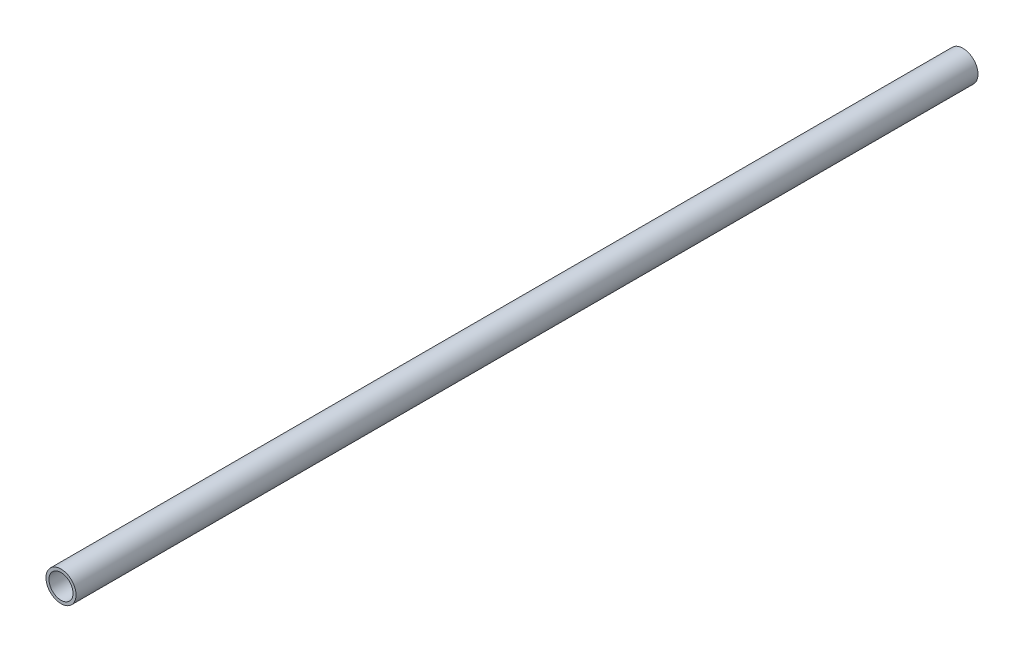
ISO-10303-21;
HEADER;
FILE_DESCRIPTION(('STEP AP214'),'2;1');
FILE_NAME('part.step','',(''),(''),'','','');
FILE_SCHEMA(('AUTOMOTIVE_DESIGN { 1 0 10303 214 1 1 1 1 }'));
ENDSEC;
DATA;
#1=APPLICATION_CONTEXT('core data for automotive mechanical design processes');
#2=APPLICATION_PROTOCOL_DEFINITION('international standard','automotive_design',2000,#1);
#3=PRODUCT_CONTEXT('',#1,'mechanical');
#4=PRODUCT('Part','Part','',(#3));
#5=PRODUCT_RELATED_PRODUCT_CATEGORY('part','',(#4));
#6=PRODUCT_DEFINITION_FORMATION('','',#4);
#7=PRODUCT_DEFINITION_CONTEXT('part definition',#1,'design');
#8=PRODUCT_DEFINITION('design','',#6,#7);
#9=PRODUCT_DEFINITION_SHAPE('','',#8);
#10=(LENGTH_UNIT() NAMED_UNIT(*) SI_UNIT(.MILLI.,.METRE.));
#11=(NAMED_UNIT(*) PLANE_ANGLE_UNIT() SI_UNIT($,.RADIAN.));
#12=(NAMED_UNIT(*) SI_UNIT($,.STERADIAN.) SOLID_ANGLE_UNIT());
#13=UNCERTAINTY_MEASURE_WITH_UNIT(LENGTH_MEASURE(1.E-05),#10,'distance_accuracy_value','');
#14=(GEOMETRIC_REPRESENTATION_CONTEXT(3) GLOBAL_UNCERTAINTY_ASSIGNED_CONTEXT((#13)) GLOBAL_UNIT_ASSIGNED_CONTEXT((#10,
#11,#12)) REPRESENTATION_CONTEXT('',''));
#15=CARTESIAN_POINT('',(0.,0.,0.));
#16=DIRECTION('',(0.,0.,1.));
#17=DIRECTION('',(1.,0.,0.));
#18=AXIS2_PLACEMENT_3D('',#15,#16,#17);
#19=CARTESIAN_POINT('',(0.,0.,300.));
#20=DIRECTION('',(0.,0.,1.));
#21=DIRECTION('',(1.,0.,0.));
#22=AXIS2_PLACEMENT_3D('',#19,#20,#21);
#23=PLANE('',#22);
#24=CARTESIAN_POINT('',(0.,0.,300.));
#25=DIRECTION('',(0.,0.,1.));
#26=DIRECTION('',(1.,0.,0.));
#27=AXIS2_PLACEMENT_3D('',#24,#25,#26);
#28=CIRCLE('',#27,5.);
#29=CARTESIAN_POINT('',(5.,0.,300.));
#30=VERTEX_POINT('',#29);
#31=EDGE_CURVE('E10',#30,#30,#28,.T.);
#32=ORIENTED_EDGE('',*,*,#31,.T.);
#33=EDGE_LOOP('',(#32));
#34=FACE_BOUND('',#33,.T.);
#35=CARTESIAN_POINT('',(0.,0.,300.));
#36=DIRECTION('',(0.,0.,1.));
#37=DIRECTION('',(1.,0.,0.));
#38=AXIS2_PLACEMENT_3D('',#35,#36,#37);
#39=CIRCLE('',#38,4.);
#40=CARTESIAN_POINT('',(4.,0.,300.));
#41=VERTEX_POINT('',#40);
#42=EDGE_CURVE('E47',#41,#41,#39,.T.);
#43=ORIENTED_EDGE('',*,*,#42,.F.);
#44=EDGE_LOOP('',(#43));
#45=FACE_BOUND('',#44,.T.);
#46=ADVANCED_FACE('F36',(#34,#45),#23,.T.);
#47=CARTESIAN_POINT('',(0.,0.,0.));
#48=DIRECTION('',(0.,0.,1.));
#49=DIRECTION('',(1.,0.,0.));
#50=AXIS2_PLACEMENT_3D('',#47,#48,#49);
#51=PLANE('',#50);
#52=CARTESIAN_POINT('',(0.,0.,0.));
#53=DIRECTION('',(0.,0.,1.));
#54=DIRECTION('',(1.,0.,0.));
#55=AXIS2_PLACEMENT_3D('',#52,#53,#54);
#56=CIRCLE('',#55,5.);
#57=CARTESIAN_POINT('',(5.,0.,0.));
#58=VERTEX_POINT('',#57);
#59=EDGE_CURVE('E40',#58,#58,#56,.T.);
#60=ORIENTED_EDGE('',*,*,#59,.F.);
#61=EDGE_LOOP('',(#60));
#62=FACE_BOUND('',#61,.T.);
#63=CARTESIAN_POINT('',(0.,0.,0.));
#64=DIRECTION('',(0.,0.,1.));
#65=DIRECTION('',(1.,0.,0.));
#66=AXIS2_PLACEMENT_3D('',#63,#64,#65);
#67=CIRCLE('',#66,4.);
#68=CARTESIAN_POINT('',(4.,0.,0.));
#69=VERTEX_POINT('',#68);
#70=EDGE_CURVE('E49',#69,#69,#67,.T.);
#71=ORIENTED_EDGE('',*,*,#70,.T.);
#72=EDGE_LOOP('',(#71));
#73=FACE_BOUND('',#72,.T.);
#74=ADVANCED_FACE('F59',(#62,#73),#51,.F.);
#75=CARTESIAN_POINT('',(0.,0.,300.));
#76=DIRECTION('',(0.,0.,-1.));
#77=DIRECTION('',(-1.,0.,0.));
#78=AXIS2_PLACEMENT_3D('',#75,#76,#77);
#79=CYLINDRICAL_SURFACE('',#78,5.);
#80=ORIENTED_EDGE('',*,*,#31,.F.);
#81=EDGE_LOOP('',(#80));
#82=FACE_BOUND('',#81,.T.);
#83=ORIENTED_EDGE('',*,*,#59,.T.);
#84=EDGE_LOOP('',(#83));
#85=FACE_BOUND('',#84,.T.);
#86=ADVANCED_FACE('F38',(#82,#85),#79,.T.);
#87=CARTESIAN_POINT('',(0.,0.,300.));
#88=DIRECTION('',(0.,0.,-1.));
#89=DIRECTION('',(-1.,0.,0.));
#90=AXIS2_PLACEMENT_3D('',#87,#88,#89);
#91=CYLINDRICAL_SURFACE('',#90,4.);
#92=ORIENTED_EDGE('',*,*,#42,.T.);
#93=EDGE_LOOP('',(#92));
#94=FACE_BOUND('',#93,.T.);
#95=ORIENTED_EDGE('',*,*,#70,.F.);
#96=EDGE_LOOP('',(#95));
#97=FACE_BOUND('',#96,.T.);
#98=ADVANCED_FACE('F55',(#94,#97),#91,.F.);
#99=CLOSED_SHELL('',(#46,#74,#86,#98));
#100=MANIFOLD_SOLID_BREP('B2',#99);
#101=ADVANCED_BREP_SHAPE_REPRESENTATION('',(#18,#100),#14);
#102=SHAPE_DEFINITION_REPRESENTATION(#9,#101);
ENDSEC;
END-ISO-10303-21;
